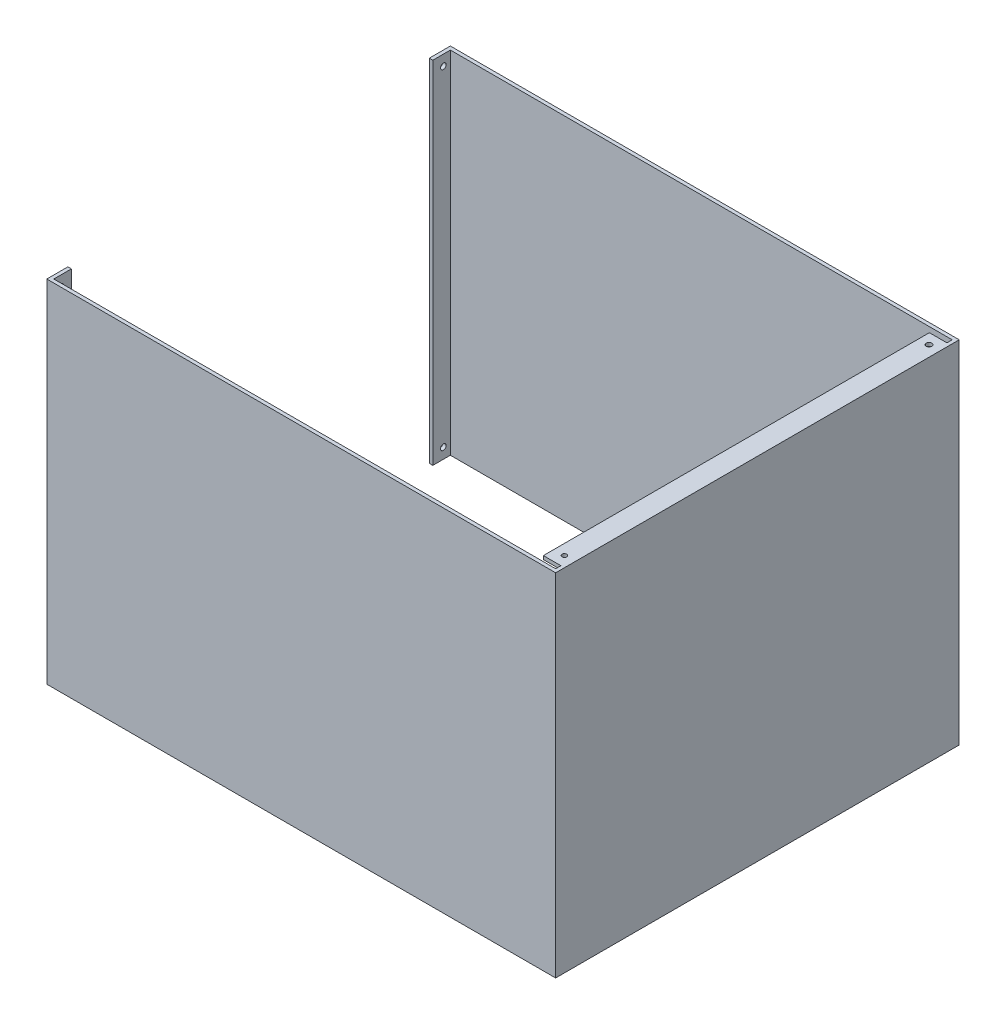
ISO-10303-21;
HEADER;
FILE_DESCRIPTION(('STEP AP214'),'2;1');
FILE_NAME('part.step','',(''),(''),'','','');
FILE_SCHEMA(('AUTOMOTIVE_DESIGN { 1 0 10303 214 1 1 1 1 }'));
ENDSEC;
DATA;
#1=APPLICATION_CONTEXT('core data for automotive mechanical design processes');
#2=APPLICATION_PROTOCOL_DEFINITION('international standard','automotive_design',2000,#1);
#3=PRODUCT_CONTEXT('',#1,'mechanical');
#4=PRODUCT('Part','Part','',(#3));
#5=PRODUCT_RELATED_PRODUCT_CATEGORY('part','',(#4));
#6=PRODUCT_DEFINITION_FORMATION('','',#4);
#7=PRODUCT_DEFINITION_CONTEXT('part definition',#1,'design');
#8=PRODUCT_DEFINITION('design','',#6,#7);
#9=PRODUCT_DEFINITION_SHAPE('','',#8);
#10=(LENGTH_UNIT() NAMED_UNIT(*) SI_UNIT(.MILLI.,.METRE.));
#11=(NAMED_UNIT(*) PLANE_ANGLE_UNIT() SI_UNIT($,.RADIAN.));
#12=(NAMED_UNIT(*) SI_UNIT($,.STERADIAN.) SOLID_ANGLE_UNIT());
#13=UNCERTAINTY_MEASURE_WITH_UNIT(LENGTH_MEASURE(1.E-05),#10,'distance_accuracy_value','');
#14=(GEOMETRIC_REPRESENTATION_CONTEXT(3) GLOBAL_UNCERTAINTY_ASSIGNED_CONTEXT((#13)) GLOBAL_UNIT_ASSIGNED_CONTEXT((#10,
#11,#12)) REPRESENTATION_CONTEXT('',''));
#15=CARTESIAN_POINT('',(0.,0.,0.));
#16=DIRECTION('',(0.,0.,1.));
#17=DIRECTION('',(1.,0.,0.));
#18=AXIS2_PLACEMENT_3D('',#15,#16,#17);
#19=CARTESIAN_POINT('',(-143.,0.,-113.));
#20=DIRECTION('',(0.,0.,-1.));
#21=DIRECTION('',(-1.,0.,0.));
#22=AXIS2_PLACEMENT_3D('',#19,#20,#21);
#23=PLANE('',#22);
#24=DIRECTION('',(0.,-1.,0.));
#25=VECTOR('',#24,1.);
#26=CARTESIAN_POINT('',(-143.,200.,-113.));
#27=LINE('',#26,#25);
#28=CARTESIAN_POINT('',(-143.,200.,-113.));
#29=VERTEX_POINT('',#28);
#30=CARTESIAN_POINT('',(-143.,0.,-113.));
#31=VERTEX_POINT('',#30);
#32=EDGE_CURVE('E50',#29,#31,#27,.T.);
#33=ORIENTED_EDGE('',*,*,#32,.T.);
#34=DIRECTION('',(-1.,0.,0.));
#35=VECTOR('',#34,1.);
#36=CARTESIAN_POINT('',(-143.,0.,-113.));
#37=LINE('',#36,#35);
#38=CARTESIAN_POINT('',(143.,0.,-113.));
#39=VERTEX_POINT('',#38);
#40=EDGE_CURVE('E171',#39,#31,#37,.T.);
#41=ORIENTED_EDGE('',*,*,#40,.F.);
#42=DIRECTION('',(0.,1.,0.));
#43=VECTOR('',#42,1.);
#44=CARTESIAN_POINT('',(143.,0.,-113.));
#45=LINE('',#44,#43);
#46=CARTESIAN_POINT('',(143.,200.,-113.));
#47=VERTEX_POINT('',#46);
#48=EDGE_CURVE('E262',#39,#47,#45,.T.);
#49=ORIENTED_EDGE('',*,*,#48,.T.);
#50=DIRECTION('',(-1.,0.,0.));
#51=VECTOR('',#50,1.);
#52=CARTESIAN_POINT('',(-143.,200.,-113.));
#53=LINE('',#52,#51);
#54=EDGE_CURVE('E55',#47,#29,#53,.T.);
#55=ORIENTED_EDGE('',*,*,#54,.T.);
#56=EDGE_LOOP('',(#33,#41,#49,#55));
#57=FACE_BOUND('',#56,.T.);
#58=ADVANCED_FACE('F35',(#57),#23,.F.);
#59=CARTESIAN_POINT('',(-145.,200.,-115.));
#60=DIRECTION('',(1.,0.,0.));
#61=DIRECTION('',(0.,0.,-1.));
#62=AXIS2_PLACEMENT_3D('',#59,#60,#61);
#63=PLANE('',#62);
#64=CARTESIAN_POINT('',(-145.,6.00000000000001,109.));
#65=DIRECTION('',(-1.,0.,0.));
#66=DIRECTION('',(0.,0.,1.));
#67=AXIS2_PLACEMENT_3D('',#64,#65,#66);
#68=CIRCLE('',#67,1.60000000000001);
#69=CARTESIAN_POINT('',(-145.,6.00000000000001,110.6));
#70=VERTEX_POINT('',#69);
#71=EDGE_CURVE('E179',#70,#70,#68,.T.);
#72=ORIENTED_EDGE('',*,*,#71,.F.);
#73=EDGE_LOOP('',(#72));
#74=FACE_BOUND('',#73,.T.);
#75=CARTESIAN_POINT('',(-145.,194.,109.));
#76=DIRECTION('',(-1.,0.,0.));
#77=DIRECTION('',(0.,0.,1.));
#78=AXIS2_PLACEMENT_3D('',#75,#76,#77);
#79=CIRCLE('',#78,1.6);
#80=CARTESIAN_POINT('',(-145.,194.,110.6));
#81=VERTEX_POINT('',#80);
#82=EDGE_CURVE('E184',#81,#81,#79,.T.);
#83=ORIENTED_EDGE('',*,*,#82,.F.);
#84=EDGE_LOOP('',(#83));
#85=FACE_BOUND('',#84,.T.);
#86=DIRECTION('',(0.,0.,1.));
#87=VECTOR('',#86,1.);
#88=CARTESIAN_POINT('',(-145.,200.,-115.));
#89=LINE('',#88,#87);
#90=CARTESIAN_POINT('',(-145.,200.,103.));
#91=VERTEX_POINT('',#90);
#92=CARTESIAN_POINT('',(-145.,200.,115.));
#93=VERTEX_POINT('',#92);
#94=EDGE_CURVE('E278',#91,#93,#89,.T.);
#95=ORIENTED_EDGE('',*,*,#94,.F.);
#96=DIRECTION('',(0.,-1.,0.));
#97=VECTOR('',#96,1.);
#98=CARTESIAN_POINT('',(-145.,200.,103.));
#99=LINE('',#98,#97);
#100=CARTESIAN_POINT('',(-145.,0.,103.));
#101=VERTEX_POINT('',#100);
#102=EDGE_CURVE('E190',#91,#101,#99,.T.);
#103=ORIENTED_EDGE('',*,*,#102,.T.);
#104=DIRECTION('',(0.,0.,1.));
#105=VECTOR('',#104,1.);
#106=CARTESIAN_POINT('',(-145.,0.,-115.));
#107=LINE('',#106,#105);
#108=CARTESIAN_POINT('',(-145.,0.,115.));
#109=VERTEX_POINT('',#108);
#110=EDGE_CURVE('E288',#101,#109,#107,.T.);
#111=ORIENTED_EDGE('',*,*,#110,.T.);
#112=DIRECTION('',(0.,-1.,0.));
#113=VECTOR('',#112,1.);
#114=CARTESIAN_POINT('',(-145.,200.,115.));
#115=LINE('',#114,#113);
#116=EDGE_CURVE('E294',#93,#109,#115,.T.);
#117=ORIENTED_EDGE('',*,*,#116,.F.);
#118=EDGE_LOOP('',(#95,#103,#111,#117));
#119=FACE_BOUND('',#118,.T.);
#120=ADVANCED_FACE('F319',(#74,#85,#119),#63,.F.);
#121=CARTESIAN_POINT('',(0.,200.,0.));
#122=DIRECTION('',(0.,1.,0.));
#123=DIRECTION('',(0.,0.,1.));
#124=AXIS2_PLACEMENT_3D('',#121,#122,#123);
#125=PLANE('',#124);
#126=CARTESIAN_POINT('',(139.,200.,104.));
#127=DIRECTION('',(0.,1.,0.));
#128=DIRECTION('',(0.,0.,1.));
#129=AXIS2_PLACEMENT_3D('',#126,#127,#128);
#130=CIRCLE('',#129,1.35052515793344);
#131=CARTESIAN_POINT('',(139.,200.,105.350525157933));
#132=VERTEX_POINT('',#131);
#133=EDGE_CURVE('E211',#132,#132,#130,.T.);
#134=ORIENTED_EDGE('',*,*,#133,.F.);
#135=EDGE_LOOP('',(#134));
#136=FACE_BOUND('',#135,.T.);
#137=CARTESIAN_POINT('',(138.825354176061,200.,-104.));
#138=DIRECTION('',(0.,1.,0.));
#139=DIRECTION('',(0.,0.,1.));
#140=AXIS2_PLACEMENT_3D('',#137,#138,#139);
#141=CIRCLE('',#140,1.59999999999999);
#142=CARTESIAN_POINT('',(138.825354176061,200.,-102.4));
#143=VERTEX_POINT('',#142);
#144=EDGE_CURVE('E217',#143,#143,#141,.T.);
#145=ORIENTED_EDGE('',*,*,#144,.F.);
#146=EDGE_LOOP('',(#145));
#147=FACE_BOUND('',#146,.T.);
#148=DIRECTION('',(1.,0.,0.));
#149=VECTOR('',#148,1.);
#150=CARTESIAN_POINT('',(-143.,200.,113.));
#151=LINE('',#150,#149);
#152=CARTESIAN_POINT('',(-143.,200.,113.));
#153=VERTEX_POINT('',#152);
#154=CARTESIAN_POINT('',(143.,200.,113.));
#155=VERTEX_POINT('',#154);
#156=EDGE_CURVE('E258',#153,#155,#151,.T.);
#157=ORIENTED_EDGE('',*,*,#156,.F.);
#158=DIRECTION('',(0.,0.,-1.));
#159=VECTOR('',#158,1.);
#160=CARTESIAN_POINT('',(-143.,200.,113.));
#161=LINE('',#160,#159);
#162=CARTESIAN_POINT('',(-143.,200.,103.));
#163=VERTEX_POINT('',#162);
#164=EDGE_CURVE('E196',#153,#163,#161,.T.);
#165=ORIENTED_EDGE('',*,*,#164,.T.);
#166=DIRECTION('',(-1.,0.,0.));
#167=VECTOR('',#166,1.);
#168=CARTESIAN_POINT('',(-143.,200.,103.));
#169=LINE('',#168,#167);
#170=EDGE_CURVE('E205',#163,#91,#169,.T.);
#171=ORIENTED_EDGE('',*,*,#170,.T.);
#172=ORIENTED_EDGE('',*,*,#94,.T.);
#173=DIRECTION('',(1.,0.,0.));
#174=VECTOR('',#173,1.);
#175=CARTESIAN_POINT('',(-145.,200.,115.));
#176=LINE('',#175,#174);
#177=CARTESIAN_POINT('',(145.,200.,115.));
#178=VERTEX_POINT('',#177);
#179=EDGE_CURVE('E281',#93,#178,#176,.T.);
#180=ORIENTED_EDGE('',*,*,#179,.T.);
#181=DIRECTION('',(0.,0.,-1.));
#182=VECTOR('',#181,1.);
#183=CARTESIAN_POINT('',(145.,200.,-115.));
#184=LINE('',#183,#182);
#185=CARTESIAN_POINT('',(145.,200.,-115.));
#186=VERTEX_POINT('',#185);
#187=EDGE_CURVE('E272',#178,#186,#184,.T.);
#188=ORIENTED_EDGE('',*,*,#187,.T.);
#189=DIRECTION('',(-1.,0.,0.));
#190=VECTOR('',#189,1.);
#191=CARTESIAN_POINT('',(-145.,200.,-115.));
#192=LINE('',#191,#190);
#193=CARTESIAN_POINT('',(-145.,200.,-115.));
#194=VERTEX_POINT('',#193);
#195=EDGE_CURVE('E275',#186,#194,#192,.T.);
#196=ORIENTED_EDGE('',*,*,#195,.T.);
#197=CARTESIAN_POINT('',(-145.,200.,-103.));
#198=VERTEX_POINT('',#197);
#199=EDGE_CURVE('E279',#194,#198,#89,.T.);
#200=ORIENTED_EDGE('',*,*,#199,.T.);
#201=DIRECTION('',(-1.,0.,0.));
#202=VECTOR('',#201,1.);
#203=CARTESIAN_POINT('',(-143.,200.,-103.));
#204=LINE('',#203,#202);
#205=CARTESIAN_POINT('',(-143.,200.,-103.));
#206=VERTEX_POINT('',#205);
#207=EDGE_CURVE('E160',#206,#198,#204,.T.);
#208=ORIENTED_EDGE('',*,*,#207,.F.);
#209=DIRECTION('',(0.,0.,-1.));
#210=VECTOR('',#209,1.);
#211=CARTESIAN_POINT('',(-143.,200.,-113.));
#212=LINE('',#211,#210);
#213=EDGE_CURVE('E161',#206,#29,#212,.T.);
#214=ORIENTED_EDGE('',*,*,#213,.T.);
#215=ORIENTED_EDGE('',*,*,#54,.F.);
#216=DIRECTION('',(0.,0.,-1.));
#217=VECTOR('',#216,1.);
#218=CARTESIAN_POINT('',(143.,200.,-113.));
#219=LINE('',#218,#217);
#220=CARTESIAN_POINT('',(143.,200.,-110.));
#221=VERTEX_POINT('',#220);
#222=EDGE_CURVE('E249',#221,#47,#219,.T.);
#223=ORIENTED_EDGE('',*,*,#222,.F.);
#224=DIRECTION('',(-1.,0.,0.));
#225=VECTOR('',#224,1.);
#226=CARTESIAN_POINT('',(143.,200.,-110.));
#227=LINE('',#226,#225);
#228=CARTESIAN_POINT('',(133.,200.,-110.));
#229=VERTEX_POINT('',#228);
#230=EDGE_CURVE('E223',#221,#229,#227,.T.);
#231=ORIENTED_EDGE('',*,*,#230,.T.);
#232=DIRECTION('',(0.,0.,1.));
#233=VECTOR('',#232,1.);
#234=CARTESIAN_POINT('',(133.,200.,-110.));
#235=LINE('',#234,#233);
#236=CARTESIAN_POINT('',(133.,200.,110.));
#237=VERTEX_POINT('',#236);
#238=EDGE_CURVE('E241',#229,#237,#235,.T.);
#239=ORIENTED_EDGE('',*,*,#238,.T.);
#240=DIRECTION('',(1.,0.,0.));
#241=VECTOR('',#240,1.);
#242=CARTESIAN_POINT('',(143.,200.,110.));
#243=LINE('',#242,#241);
#244=CARTESIAN_POINT('',(143.,200.,110.));
#245=VERTEX_POINT('',#244);
#246=EDGE_CURVE('E229',#237,#245,#243,.T.);
#247=ORIENTED_EDGE('',*,*,#246,.T.);
#248=EDGE_CURVE('E263',#155,#245,#219,.T.);
#249=ORIENTED_EDGE('',*,*,#248,.F.);
#250=EDGE_LOOP('',(#157,#165,#171,#172,#180,#188,#196,#200,#208,#214,#215,#223,#231,#239,#247,#249));
#251=FACE_BOUND('',#250,.T.);
#252=ADVANCED_FACE('F322',(#136,#147,#251),#125,.T.);
#253=CARTESIAN_POINT('',(0.,0.,0.));
#254=DIRECTION('',(0.,1.,0.));
#255=DIRECTION('',(0.,0.,1.));
#256=AXIS2_PLACEMENT_3D('',#253,#254,#255);
#257=PLANE('',#256);
#258=ORIENTED_EDGE('',*,*,#110,.F.);
#259=DIRECTION('',(-1.,0.,0.));
#260=VECTOR('',#259,1.);
#261=CARTESIAN_POINT('',(-143.,0.,103.));
#262=LINE('',#261,#260);
#263=CARTESIAN_POINT('',(-143.,0.,103.));
#264=VERTEX_POINT('',#263);
#265=EDGE_CURVE('E208',#264,#101,#262,.T.);
#266=ORIENTED_EDGE('',*,*,#265,.F.);
#267=DIRECTION('',(0.,0.,1.));
#268=VECTOR('',#267,1.);
#269=CARTESIAN_POINT('',(-143.,0.,113.));
#270=LINE('',#269,#268);
#271=CARTESIAN_POINT('',(-143.,0.,113.));
#272=VERTEX_POINT('',#271);
#273=EDGE_CURVE('E202',#264,#272,#270,.T.);
#274=ORIENTED_EDGE('',*,*,#273,.T.);
#275=DIRECTION('',(1.,0.,0.));
#276=VECTOR('',#275,1.);
#277=CARTESIAN_POINT('',(-143.,0.,113.));
#278=LINE('',#277,#276);
#279=CARTESIAN_POINT('',(143.,0.,113.));
#280=VERTEX_POINT('',#279);
#281=EDGE_CURVE('E260',#272,#280,#278,.T.);
#282=ORIENTED_EDGE('',*,*,#281,.T.);
#283=DIRECTION('',(0.,0.,-1.));
#284=VECTOR('',#283,1.);
#285=CARTESIAN_POINT('',(143.,0.,-113.));
#286=LINE('',#285,#284);
#287=EDGE_CURVE('E256',#280,#39,#286,.T.);
#288=ORIENTED_EDGE('',*,*,#287,.T.);
#289=ORIENTED_EDGE('',*,*,#40,.T.);
#290=DIRECTION('',(0.,0.,1.));
#291=VECTOR('',#290,1.);
#292=CARTESIAN_POINT('',(-143.,0.,-113.));
#293=LINE('',#292,#291);
#294=CARTESIAN_POINT('',(-143.,0.,-103.));
#295=VERTEX_POINT('',#294);
#296=EDGE_CURVE('E166',#31,#295,#293,.T.);
#297=ORIENTED_EDGE('',*,*,#296,.T.);
#298=DIRECTION('',(-1.,0.,0.));
#299=VECTOR('',#298,1.);
#300=CARTESIAN_POINT('',(-143.,0.,-103.));
#301=LINE('',#300,#299);
#302=CARTESIAN_POINT('',(-145.,0.,-103.));
#303=VERTEX_POINT('',#302);
#304=EDGE_CURVE('E149',#295,#303,#301,.T.);
#305=ORIENTED_EDGE('',*,*,#304,.T.);
#306=CARTESIAN_POINT('',(-145.,0.,-115.));
#307=VERTEX_POINT('',#306);
#308=EDGE_CURVE('E289',#307,#303,#107,.T.);
#309=ORIENTED_EDGE('',*,*,#308,.F.);
#310=DIRECTION('',(-1.,0.,0.));
#311=VECTOR('',#310,1.);
#312=CARTESIAN_POINT('',(-145.,0.,-115.));
#313=LINE('',#312,#311);
#314=CARTESIAN_POINT('',(145.,0.,-115.));
#315=VERTEX_POINT('',#314);
#316=EDGE_CURVE('E286',#315,#307,#313,.T.);
#317=ORIENTED_EDGE('',*,*,#316,.F.);
#318=DIRECTION('',(0.,0.,-1.));
#319=VECTOR('',#318,1.);
#320=CARTESIAN_POINT('',(145.,0.,-115.));
#321=LINE('',#320,#319);
#322=CARTESIAN_POINT('',(145.,0.,115.));
#323=VERTEX_POINT('',#322);
#324=EDGE_CURVE('E270',#323,#315,#321,.T.);
#325=ORIENTED_EDGE('',*,*,#324,.F.);
#326=DIRECTION('',(1.,0.,0.));
#327=VECTOR('',#326,1.);
#328=CARTESIAN_POINT('',(-145.,0.,115.));
#329=LINE('',#328,#327);
#330=EDGE_CURVE('E276',#109,#323,#329,.T.);
#331=ORIENTED_EDGE('',*,*,#330,.F.);
#332=EDGE_LOOP('',(#258,#266,#274,#282,#288,#289,#297,#305,#309,#317,#325,#331));
#333=FACE_BOUND('',#332,.T.);
#334=ADVANCED_FACE('F169',(#333),#257,.F.);
#335=CARTESIAN_POINT('',(145.,200.,-115.));
#336=DIRECTION('',(-1.,0.,0.));
#337=DIRECTION('',(0.,0.,1.));
#338=AXIS2_PLACEMENT_3D('',#335,#336,#337);
#339=PLANE('',#338);
#340=ORIENTED_EDGE('',*,*,#324,.T.);
#341=DIRECTION('',(0.,-1.,0.));
#342=VECTOR('',#341,1.);
#343=CARTESIAN_POINT('',(145.,200.,-115.));
#344=LINE('',#343,#342);
#345=EDGE_CURVE('E11',#186,#315,#344,.T.);
#346=ORIENTED_EDGE('',*,*,#345,.F.);
#347=ORIENTED_EDGE('',*,*,#187,.F.);
#348=DIRECTION('',(0.,-1.,0.));
#349=VECTOR('',#348,1.);
#350=CARTESIAN_POINT('',(145.,200.,115.));
#351=LINE('',#350,#349);
#352=EDGE_CURVE('E283',#178,#323,#351,.T.);
#353=ORIENTED_EDGE('',*,*,#352,.T.);
#354=EDGE_LOOP('',(#340,#346,#347,#353));
#355=FACE_BOUND('',#354,.T.);
#356=ADVANCED_FACE('F37',(#355),#339,.F.);
#357=CARTESIAN_POINT('',(-145.,200.,-115.));
#358=DIRECTION('',(0.,0.,1.));
#359=DIRECTION('',(1.,0.,0.));
#360=AXIS2_PLACEMENT_3D('',#357,#358,#359);
#361=PLANE('',#360);
#362=ORIENTED_EDGE('',*,*,#316,.T.);
#363=DIRECTION('',(0.,-1.,0.));
#364=VECTOR('',#363,1.);
#365=CARTESIAN_POINT('',(-145.,200.,-115.));
#366=LINE('',#365,#364);
#367=EDGE_CURVE('E43',#194,#307,#366,.T.);
#368=ORIENTED_EDGE('',*,*,#367,.F.);
#369=ORIENTED_EDGE('',*,*,#195,.F.);
#370=ORIENTED_EDGE('',*,*,#345,.T.);
#371=EDGE_LOOP('',(#362,#368,#369,#370));
#372=FACE_BOUND('',#371,.T.);
#373=ADVANCED_FACE('F305',(#372),#361,.F.);
#374=CARTESIAN_POINT('',(-145.,6.,-109.));
#375=DIRECTION('',(-1.,0.,0.));
#376=DIRECTION('',(0.,0.,1.));
#377=AXIS2_PLACEMENT_3D('',#374,#375,#376);
#378=CIRCLE('',#377,1.60000000000001);
#379=CARTESIAN_POINT('',(-145.,6.,-107.4));
#380=VERTEX_POINT('',#379);
#381=EDGE_CURVE('E580',#380,#380,#378,.T.);
#382=ORIENTED_EDGE('',*,*,#381,.F.);
#383=EDGE_LOOP('',(#382));
#384=FACE_BOUND('',#383,.T.);
#385=CARTESIAN_POINT('',(-145.,194.,-109.));
#386=DIRECTION('',(-1.,0.,0.));
#387=DIRECTION('',(0.,0.,1.));
#388=AXIS2_PLACEMENT_3D('',#385,#386,#387);
#389=CIRCLE('',#388,1.6);
#390=CARTESIAN_POINT('',(-145.,194.,-107.4));
#391=VERTEX_POINT('',#390);
#392=EDGE_CURVE('E582',#391,#391,#389,.T.);
#393=ORIENTED_EDGE('',*,*,#392,.F.);
#394=EDGE_LOOP('',(#393));
#395=FACE_BOUND('',#394,.T.);
#396=ORIENTED_EDGE('',*,*,#308,.T.);
#397=DIRECTION('',(0.,1.,0.));
#398=VECTOR('',#397,1.);
#399=CARTESIAN_POINT('',(-145.,200.,-103.));
#400=LINE('',#399,#398);
#401=EDGE_CURVE('E156',#303,#198,#400,.T.);
#402=ORIENTED_EDGE('',*,*,#401,.T.);
#403=ORIENTED_EDGE('',*,*,#199,.F.);
#404=ORIENTED_EDGE('',*,*,#367,.T.);
#405=EDGE_LOOP('',(#396,#402,#403,#404));
#406=FACE_BOUND('',#405,.T.);
#407=ADVANCED_FACE('F300',(#384,#395,#406),#63,.F.);
#408=CARTESIAN_POINT('',(-145.,200.,115.));
#409=DIRECTION('',(0.,0.,-1.));
#410=DIRECTION('',(-1.,0.,0.));
#411=AXIS2_PLACEMENT_3D('',#408,#409,#410);
#412=PLANE('',#411);
#413=ORIENTED_EDGE('',*,*,#330,.T.);
#414=ORIENTED_EDGE('',*,*,#352,.F.);
#415=ORIENTED_EDGE('',*,*,#179,.F.);
#416=ORIENTED_EDGE('',*,*,#116,.T.);
#417=EDGE_LOOP('',(#413,#414,#415,#416));
#418=FACE_BOUND('',#417,.T.);
#419=ADVANCED_FACE('F311',(#418),#412,.F.);
#420=CARTESIAN_POINT('',(143.,0.,-113.));
#421=DIRECTION('',(1.,0.,0.));
#422=DIRECTION('',(0.,0.,-1.));
#423=AXIS2_PLACEMENT_3D('',#420,#421,#422);
#424=PLANE('',#423);
#425=ORIENTED_EDGE('',*,*,#248,.T.);
#426=DIRECTION('',(0.,1.,0.));
#427=VECTOR('',#426,1.);
#428=CARTESIAN_POINT('',(143.,198.,110.));
#429=LINE('',#428,#427);
#430=CARTESIAN_POINT('',(143.,198.,110.));
#431=VERTEX_POINT('',#430);
#432=EDGE_CURVE('E246',#431,#245,#429,.T.);
#433=ORIENTED_EDGE('',*,*,#432,.F.);
#434=DIRECTION('',(0.,0.,-1.));
#435=VECTOR('',#434,1.);
#436=CARTESIAN_POINT('',(143.,198.,-110.));
#437=LINE('',#436,#435);
#438=CARTESIAN_POINT('',(143.,198.,-110.));
#439=VERTEX_POINT('',#438);
#440=EDGE_CURVE('E226',#431,#439,#437,.T.);
#441=ORIENTED_EDGE('',*,*,#440,.T.);
#442=DIRECTION('',(0.,1.,0.));
#443=VECTOR('',#442,1.);
#444=CARTESIAN_POINT('',(143.,198.,-110.));
#445=LINE('',#444,#443);
#446=EDGE_CURVE('E238',#439,#221,#445,.T.);
#447=ORIENTED_EDGE('',*,*,#446,.T.);
#448=ORIENTED_EDGE('',*,*,#222,.T.);
#449=ORIENTED_EDGE('',*,*,#48,.F.);
#450=ORIENTED_EDGE('',*,*,#287,.F.);
#451=DIRECTION('',(0.,1.,0.));
#452=VECTOR('',#451,1.);
#453=CARTESIAN_POINT('',(143.,0.,113.));
#454=LINE('',#453,#452);
#455=EDGE_CURVE('E267',#280,#155,#454,.T.);
#456=ORIENTED_EDGE('',*,*,#455,.T.);
#457=EDGE_LOOP('',(#425,#433,#441,#447,#448,#449,#450,#456));
#458=FACE_BOUND('',#457,.T.);
#459=ADVANCED_FACE('F332',(#458),#424,.F.);
#460=CARTESIAN_POINT('',(-143.,0.,113.));
#461=DIRECTION('',(0.,0.,1.));
#462=DIRECTION('',(1.,0.,0.));
#463=AXIS2_PLACEMENT_3D('',#460,#461,#462);
#464=PLANE('',#463);
#465=ORIENTED_EDGE('',*,*,#281,.F.);
#466=DIRECTION('',(0.,1.,0.));
#467=VECTOR('',#466,1.);
#468=CARTESIAN_POINT('',(-143.,200.,113.));
#469=LINE('',#468,#467);
#470=EDGE_CURVE('E193',#272,#153,#469,.T.);
#471=ORIENTED_EDGE('',*,*,#470,.T.);
#472=ORIENTED_EDGE('',*,*,#156,.T.);
#473=ORIENTED_EDGE('',*,*,#455,.F.);
#474=EDGE_LOOP('',(#465,#471,#472,#473));
#475=FACE_BOUND('',#474,.T.);
#476=ADVANCED_FACE('F328',(#475),#464,.F.);
#477=CARTESIAN_POINT('',(143.,198.,110.));
#478=DIRECTION('',(0.,0.,1.));
#479=DIRECTION('',(1.,0.,0.));
#480=AXIS2_PLACEMENT_3D('',#477,#478,#479);
#481=PLANE('',#480);
#482=ORIENTED_EDGE('',*,*,#246,.F.);
#483=DIRECTION('',(0.,1.,0.));
#484=VECTOR('',#483,1.);
#485=CARTESIAN_POINT('',(133.,198.,110.));
#486=LINE('',#485,#484);
#487=CARTESIAN_POINT('',(133.,198.,110.));
#488=VERTEX_POINT('',#487);
#489=EDGE_CURVE('E250',#488,#237,#486,.T.);
#490=ORIENTED_EDGE('',*,*,#489,.F.);
#491=DIRECTION('',(1.,0.,0.));
#492=VECTOR('',#491,1.);
#493=CARTESIAN_POINT('',(143.,198.,110.));
#494=LINE('',#493,#492);
#495=EDGE_CURVE('E235',#488,#431,#494,.T.);
#496=ORIENTED_EDGE('',*,*,#495,.T.);
#497=ORIENTED_EDGE('',*,*,#432,.T.);
#498=EDGE_LOOP('',(#482,#490,#496,#497));
#499=FACE_BOUND('',#498,.T.);
#500=ADVANCED_FACE('F382',(#499),#481,.T.);
#501=CARTESIAN_POINT('',(133.,198.,-110.));
#502=DIRECTION('',(-1.,0.,0.));
#503=DIRECTION('',(0.,0.,1.));
#504=AXIS2_PLACEMENT_3D('',#501,#502,#503);
#505=PLANE('',#504);
#506=ORIENTED_EDGE('',*,*,#238,.F.);
#507=DIRECTION('',(0.,1.,0.));
#508=VECTOR('',#507,1.);
#509=CARTESIAN_POINT('',(133.,198.,-110.));
#510=LINE('',#509,#508);
#511=CARTESIAN_POINT('',(133.,198.,-110.));
#512=VERTEX_POINT('',#511);
#513=EDGE_CURVE('E252',#512,#229,#510,.T.);
#514=ORIENTED_EDGE('',*,*,#513,.F.);
#515=DIRECTION('',(0.,0.,1.));
#516=VECTOR('',#515,1.);
#517=CARTESIAN_POINT('',(133.,198.,-110.));
#518=LINE('',#517,#516);
#519=EDGE_CURVE('E232',#512,#488,#518,.T.);
#520=ORIENTED_EDGE('',*,*,#519,.T.);
#521=ORIENTED_EDGE('',*,*,#489,.T.);
#522=EDGE_LOOP('',(#506,#514,#520,#521));
#523=FACE_BOUND('',#522,.T.);
#524=ADVANCED_FACE('F387',(#523),#505,.T.);
#525=CARTESIAN_POINT('',(143.,198.,-110.));
#526=DIRECTION('',(0.,0.,-1.));
#527=DIRECTION('',(-1.,0.,0.));
#528=AXIS2_PLACEMENT_3D('',#525,#526,#527);
#529=PLANE('',#528);
#530=ORIENTED_EDGE('',*,*,#230,.F.);
#531=ORIENTED_EDGE('',*,*,#446,.F.);
#532=DIRECTION('',(-1.,0.,0.));
#533=VECTOR('',#532,1.);
#534=CARTESIAN_POINT('',(143.,198.,-110.));
#535=LINE('',#534,#533);
#536=EDGE_CURVE('E228',#439,#512,#535,.T.);
#537=ORIENTED_EDGE('',*,*,#536,.T.);
#538=ORIENTED_EDGE('',*,*,#513,.T.);
#539=EDGE_LOOP('',(#530,#531,#537,#538));
#540=FACE_BOUND('',#539,.T.);
#541=ADVANCED_FACE('F398',(#540),#529,.T.);
#542=CARTESIAN_POINT('',(0.,198.,0.));
#543=DIRECTION('',(0.,-1.,0.));
#544=DIRECTION('',(0.,0.,-1.));
#545=AXIS2_PLACEMENT_3D('',#542,#543,#544);
#546=PLANE('',#545);
#547=CARTESIAN_POINT('',(139.,198.,104.));
#548=DIRECTION('',(0.,1.,0.));
#549=DIRECTION('',(0.,0.,1.));
#550=AXIS2_PLACEMENT_3D('',#547,#548,#549);
#551=CIRCLE('',#550,1.35052515793344);
#552=CARTESIAN_POINT('',(139.,198.,105.350525157933));
#553=VERTEX_POINT('',#552);
#554=EDGE_CURVE('E214',#553,#553,#551,.T.);
#555=ORIENTED_EDGE('',*,*,#554,.T.);
#556=EDGE_LOOP('',(#555));
#557=FACE_BOUND('',#556,.T.);
#558=CARTESIAN_POINT('',(138.825354176061,198.,-104.));
#559=DIRECTION('',(0.,1.,0.));
#560=DIRECTION('',(0.,0.,1.));
#561=AXIS2_PLACEMENT_3D('',#558,#559,#560);
#562=CIRCLE('',#561,1.59999999999999);
#563=CARTESIAN_POINT('',(138.825354176061,198.,-102.4));
#564=VERTEX_POINT('',#563);
#565=EDGE_CURVE('E220',#564,#564,#562,.T.);
#566=ORIENTED_EDGE('',*,*,#565,.T.);
#567=EDGE_LOOP('',(#566));
#568=FACE_BOUND('',#567,.T.);
#569=ORIENTED_EDGE('',*,*,#440,.F.);
#570=ORIENTED_EDGE('',*,*,#495,.F.);
#571=ORIENTED_EDGE('',*,*,#519,.F.);
#572=ORIENTED_EDGE('',*,*,#536,.F.);
#573=EDGE_LOOP('',(#569,#570,#571,#572));
#574=FACE_BOUND('',#573,.T.);
#575=ADVANCED_FACE('F408',(#557,#568,#574),#546,.T.);
#576=CARTESIAN_POINT('',(138.825354176061,198.,-104.));
#577=DIRECTION('',(0.,1.,0.));
#578=DIRECTION('',(0.,0.,1.));
#579=AXIS2_PLACEMENT_3D('',#576,#577,#578);
#580=CYLINDRICAL_SURFACE('',#579,1.59999999999999);
#581=ORIENTED_EDGE('',*,*,#565,.F.);
#582=EDGE_LOOP('',(#581));
#583=FACE_BOUND('',#582,.T.);
#584=ORIENTED_EDGE('',*,*,#144,.T.);
#585=EDGE_LOOP('',(#584));
#586=FACE_BOUND('',#585,.T.);
#587=ADVANCED_FACE('F415',(#583,#586),#580,.F.);
#588=CARTESIAN_POINT('',(139.,198.,104.));
#589=DIRECTION('',(0.,1.,0.));
#590=DIRECTION('',(0.,0.,1.));
#591=AXIS2_PLACEMENT_3D('',#588,#589,#590);
#592=CYLINDRICAL_SURFACE('',#591,1.35052515793344);
#593=ORIENTED_EDGE('',*,*,#554,.F.);
#594=EDGE_LOOP('',(#593));
#595=FACE_BOUND('',#594,.T.);
#596=ORIENTED_EDGE('',*,*,#133,.T.);
#597=EDGE_LOOP('',(#596));
#598=FACE_BOUND('',#597,.T.);
#599=ADVANCED_FACE('F420',(#595,#598),#592,.F.);
#600=CARTESIAN_POINT('',(-143.,200.,103.));
#601=DIRECTION('',(0.,0.,-1.));
#602=DIRECTION('',(0.,1.,0.));
#603=AXIS2_PLACEMENT_3D('',#600,#601,#602);
#604=PLANE('',#603);
#605=ORIENTED_EDGE('',*,*,#102,.F.);
#606=ORIENTED_EDGE('',*,*,#170,.F.);
#607=DIRECTION('',(0.,-1.,0.));
#608=VECTOR('',#607,1.);
#609=CARTESIAN_POINT('',(-143.,200.,103.));
#610=LINE('',#609,#608);
#611=EDGE_CURVE('E199',#163,#264,#610,.T.);
#612=ORIENTED_EDGE('',*,*,#611,.T.);
#613=ORIENTED_EDGE('',*,*,#265,.T.);
#614=EDGE_LOOP('',(#605,#606,#612,#613));
#615=FACE_BOUND('',#614,.T.);
#616=ADVANCED_FACE('F316',(#615),#604,.T.);
#617=CARTESIAN_POINT('',(-143.,0.,0.));
#618=DIRECTION('',(1.,0.,0.));
#619=DIRECTION('',(0.,0.,-1.));
#620=AXIS2_PLACEMENT_3D('',#617,#618,#619);
#621=PLANE('',#620);
#622=CARTESIAN_POINT('',(-143.,6.00000000000001,109.));
#623=DIRECTION('',(-1.,0.,0.));
#624=DIRECTION('',(0.,0.,1.));
#625=AXIS2_PLACEMENT_3D('',#622,#623,#624);
#626=CIRCLE('',#625,1.60000000000001);
#627=CARTESIAN_POINT('',(-143.,6.00000000000001,110.6));
#628=VERTEX_POINT('',#627);
#629=EDGE_CURVE('E181',#628,#628,#626,.T.);
#630=ORIENTED_EDGE('',*,*,#629,.T.);
#631=EDGE_LOOP('',(#630));
#632=FACE_BOUND('',#631,.T.);
#633=CARTESIAN_POINT('',(-143.,194.,109.));
#634=DIRECTION('',(-1.,0.,0.));
#635=DIRECTION('',(0.,0.,1.));
#636=AXIS2_PLACEMENT_3D('',#633,#634,#635);
#637=CIRCLE('',#636,1.6);
#638=CARTESIAN_POINT('',(-143.,194.,110.6));
#639=VERTEX_POINT('',#638);
#640=EDGE_CURVE('E187',#639,#639,#637,.T.);
#641=ORIENTED_EDGE('',*,*,#640,.T.);
#642=EDGE_LOOP('',(#641));
#643=FACE_BOUND('',#642,.T.);
#644=ORIENTED_EDGE('',*,*,#470,.F.);
#645=ORIENTED_EDGE('',*,*,#273,.F.);
#646=ORIENTED_EDGE('',*,*,#611,.F.);
#647=ORIENTED_EDGE('',*,*,#164,.F.);
#648=EDGE_LOOP('',(#644,#645,#646,#647));
#649=FACE_BOUND('',#648,.T.);
#650=ADVANCED_FACE('F324',(#632,#643,#649),#621,.T.);
#651=CARTESIAN_POINT('',(-143.,194.,109.));
#652=DIRECTION('',(-1.,0.,0.));
#653=DIRECTION('',(0.,0.,1.));
#654=AXIS2_PLACEMENT_3D('',#651,#652,#653);
#655=CYLINDRICAL_SURFACE('',#654,1.6);
#656=ORIENTED_EDGE('',*,*,#640,.F.);
#657=EDGE_LOOP('',(#656));
#658=FACE_BOUND('',#657,.T.);
#659=ORIENTED_EDGE('',*,*,#82,.T.);
#660=EDGE_LOOP('',(#659));
#661=FACE_BOUND('',#660,.T.);
#662=ADVANCED_FACE('F459',(#658,#661),#655,.F.);
#663=CARTESIAN_POINT('',(-143.,6.00000000000001,109.));
#664=DIRECTION('',(-1.,0.,0.));
#665=DIRECTION('',(0.,0.,1.));
#666=AXIS2_PLACEMENT_3D('',#663,#664,#665);
#667=CYLINDRICAL_SURFACE('',#666,1.60000000000001);
#668=ORIENTED_EDGE('',*,*,#629,.F.);
#669=EDGE_LOOP('',(#668));
#670=FACE_BOUND('',#669,.T.);
#671=ORIENTED_EDGE('',*,*,#71,.T.);
#672=EDGE_LOOP('',(#671));
#673=FACE_BOUND('',#672,.T.);
#674=ADVANCED_FACE('F464',(#670,#673),#667,.F.);
#675=CARTESIAN_POINT('',(-143.,200.,-103.));
#676=DIRECTION('',(0.,0.,1.));
#677=DIRECTION('',(0.,-1.,0.));
#678=AXIS2_PLACEMENT_3D('',#675,#676,#677);
#679=PLANE('',#678);
#680=ORIENTED_EDGE('',*,*,#401,.F.);
#681=ORIENTED_EDGE('',*,*,#304,.F.);
#682=DIRECTION('',(0.,1.,0.));
#683=VECTOR('',#682,1.);
#684=CARTESIAN_POINT('',(-143.,200.,-103.));
#685=LINE('',#684,#683);
#686=EDGE_CURVE('E153',#295,#206,#685,.T.);
#687=ORIENTED_EDGE('',*,*,#686,.T.);
#688=ORIENTED_EDGE('',*,*,#207,.T.);
#689=EDGE_LOOP('',(#680,#681,#687,#688));
#690=FACE_BOUND('',#689,.T.);
#691=ADVANCED_FACE('F151',(#690),#679,.T.);
#692=CARTESIAN_POINT('',(-143.,0.,0.));
#693=DIRECTION('',(-1.,0.,0.));
#694=DIRECTION('',(0.,0.,1.));
#695=AXIS2_PLACEMENT_3D('',#692,#693,#694);
#696=PLANE('',#695);
#697=CARTESIAN_POINT('',(-143.,6.,-109.));
#698=DIRECTION('',(-1.,0.,0.));
#699=DIRECTION('',(0.,0.,1.));
#700=AXIS2_PLACEMENT_3D('',#697,#698,#699);
#701=CIRCLE('',#700,1.60000000000001);
#702=CARTESIAN_POINT('',(-143.,6.,-107.4));
#703=VERTEX_POINT('',#702);
#704=EDGE_CURVE('E577',#703,#703,#701,.T.);
#705=ORIENTED_EDGE('',*,*,#704,.T.);
#706=EDGE_LOOP('',(#705));
#707=FACE_BOUND('',#706,.T.);
#708=CARTESIAN_POINT('',(-143.,194.,-109.));
#709=DIRECTION('',(-1.,0.,0.));
#710=DIRECTION('',(0.,0.,1.));
#711=AXIS2_PLACEMENT_3D('',#708,#709,#710);
#712=CIRCLE('',#711,1.6);
#713=CARTESIAN_POINT('',(-143.,194.,-107.4));
#714=VERTEX_POINT('',#713);
#715=EDGE_CURVE('E178',#714,#714,#712,.T.);
#716=ORIENTED_EDGE('',*,*,#715,.T.);
#717=EDGE_LOOP('',(#716));
#718=FACE_BOUND('',#717,.T.);
#719=ORIENTED_EDGE('',*,*,#32,.F.);
#720=ORIENTED_EDGE('',*,*,#213,.F.);
#721=ORIENTED_EDGE('',*,*,#686,.F.);
#722=ORIENTED_EDGE('',*,*,#296,.F.);
#723=EDGE_LOOP('',(#719,#720,#721,#722));
#724=FACE_BOUND('',#723,.T.);
#725=ADVANCED_FACE('F165',(#707,#718,#724),#696,.F.);
#726=CARTESIAN_POINT('',(-143.,194.,-109.));
#727=DIRECTION('',(-1.,0.,0.));
#728=DIRECTION('',(0.,0.,1.));
#729=AXIS2_PLACEMENT_3D('',#726,#727,#728);
#730=CYLINDRICAL_SURFACE('',#729,1.6);
#731=ORIENTED_EDGE('',*,*,#715,.F.);
#732=EDGE_LOOP('',(#731));
#733=FACE_BOUND('',#732,.T.);
#734=ORIENTED_EDGE('',*,*,#392,.T.);
#735=EDGE_LOOP('',(#734));
#736=FACE_BOUND('',#735,.T.);
#737=ADVANCED_FACE('F504',(#733,#736),#730,.F.);
#738=CARTESIAN_POINT('',(-143.,6.,-109.));
#739=DIRECTION('',(-1.,0.,0.));
#740=DIRECTION('',(0.,0.,1.));
#741=AXIS2_PLACEMENT_3D('',#738,#739,#740);
#742=CYLINDRICAL_SURFACE('',#741,1.60000000000001);
#743=ORIENTED_EDGE('',*,*,#704,.F.);
#744=EDGE_LOOP('',(#743));
#745=FACE_BOUND('',#744,.T.);
#746=ORIENTED_EDGE('',*,*,#381,.T.);
#747=EDGE_LOOP('',(#746));
#748=FACE_BOUND('',#747,.T.);
#749=ADVANCED_FACE('F513',(#745,#748),#742,.F.);
#750=CLOSED_SHELL('',(#58,#120,#252,#334,#356,#373,#407,#419,#459,#476,#500,#524,#541,#575,#587,
#599,#616,#650,#662,#674,#691,#725,#737,#749));
#751=MANIFOLD_SOLID_BREP('B2',#750);
#752=ADVANCED_BREP_SHAPE_REPRESENTATION('',(#18,#751),#14);
#753=SHAPE_DEFINITION_REPRESENTATION(#9,#752);
ENDSEC;
END-ISO-10303-21;
